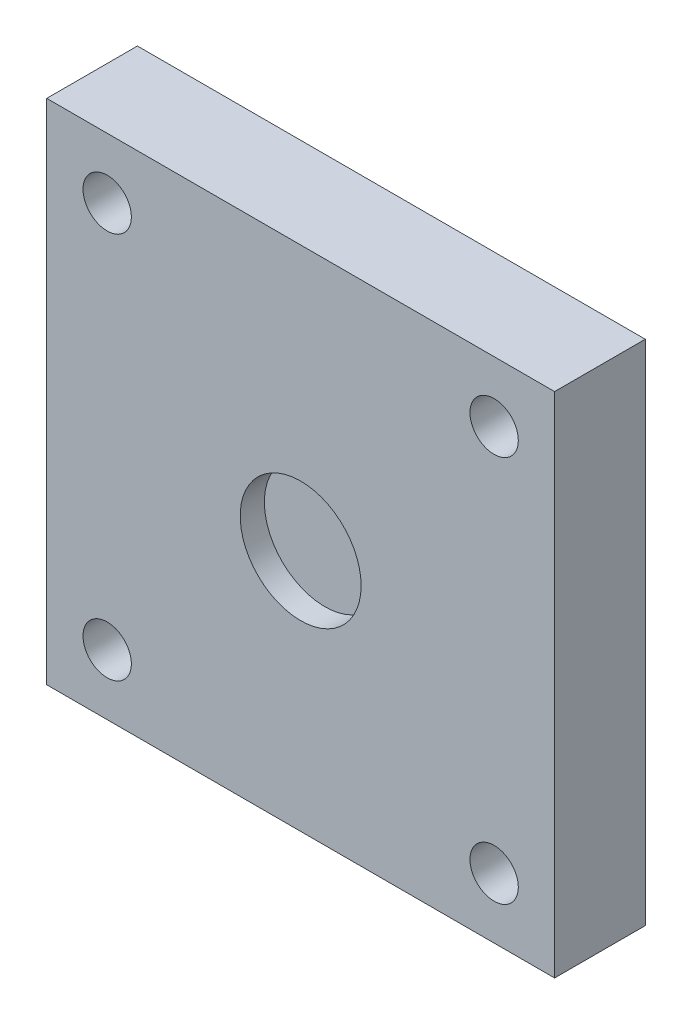
ISO-10303-21;
HEADER;
FILE_DESCRIPTION(('STEP AP214'),'2;1');
FILE_NAME('part.step','',(''),(''),'','','');
FILE_SCHEMA(('AUTOMOTIVE_DESIGN { 1 0 10303 214 1 1 1 1 }'));
ENDSEC;
DATA;
#1=APPLICATION_CONTEXT('core data for automotive mechanical design processes');
#2=APPLICATION_PROTOCOL_DEFINITION('international standard','automotive_design',2000,#1);
#3=PRODUCT_CONTEXT('',#1,'mechanical');
#4=PRODUCT('Part','Part','',(#3));
#5=PRODUCT_RELATED_PRODUCT_CATEGORY('part','',(#4));
#6=PRODUCT_DEFINITION_FORMATION('','',#4);
#7=PRODUCT_DEFINITION_CONTEXT('part definition',#1,'design');
#8=PRODUCT_DEFINITION('design','',#6,#7);
#9=PRODUCT_DEFINITION_SHAPE('','',#8);
#10=(LENGTH_UNIT() NAMED_UNIT(*) SI_UNIT(.MILLI.,.METRE.));
#11=(NAMED_UNIT(*) PLANE_ANGLE_UNIT() SI_UNIT($,.RADIAN.));
#12=(NAMED_UNIT(*) SI_UNIT($,.STERADIAN.) SOLID_ANGLE_UNIT());
#13=UNCERTAINTY_MEASURE_WITH_UNIT(LENGTH_MEASURE(1.E-05),#10,'distance_accuracy_value','');
#14=(GEOMETRIC_REPRESENTATION_CONTEXT(3) GLOBAL_UNCERTAINTY_ASSIGNED_CONTEXT((#13)) GLOBAL_UNIT_ASSIGNED_CONTEXT((#10,
#11,#12)) REPRESENTATION_CONTEXT('',''));
#15=CARTESIAN_POINT('',(0.,0.,0.));
#16=DIRECTION('',(0.,0.,1.));
#17=DIRECTION('',(1.,0.,0.));
#18=AXIS2_PLACEMENT_3D('',#15,#16,#17);
#19=CARTESIAN_POINT('',(0.,0.,0.));
#20=DIRECTION('',(0.,0.,-1.));
#21=DIRECTION('',(-1.,0.,0.));
#22=AXIS2_PLACEMENT_3D('',#19,#20,#21);
#23=PLANE('',#22);
#24=CARTESIAN_POINT('',(1.05217694,-3.5,0.));
#25=DIRECTION('',(0.,0.,1.));
#26=DIRECTION('',(1.,0.,0.));
#27=AXIS2_PLACEMENT_3D('',#24,#25,#26);
#28=CIRCLE('',#27,2.);
#29=CARTESIAN_POINT('',(3.05217694,-3.5,0.));
#30=VERTEX_POINT('',#29);
#31=EDGE_CURVE('E235',#30,#30,#28,.T.);
#32=ORIENTED_EDGE('',*,*,#31,.T.);
#33=EDGE_LOOP('',(#32));
#34=FACE_BOUND('',#33,.T.);
#35=CARTESIAN_POINT('',(33.05217694,28.5,0.));
#36=DIRECTION('',(0.,0.,1.));
#37=DIRECTION('',(1.,0.,0.));
#38=AXIS2_PLACEMENT_3D('',#35,#36,#37);
#39=CIRCLE('',#38,2.);
#40=CARTESIAN_POINT('',(35.05217694,28.5,0.));
#41=VERTEX_POINT('',#40);
#42=EDGE_CURVE('E241',#41,#41,#39,.T.);
#43=ORIENTED_EDGE('',*,*,#42,.T.);
#44=EDGE_LOOP('',(#43));
#45=FACE_BOUND('',#44,.T.);
#46=DIRECTION('',(1.,0.,0.));
#47=VECTOR('',#46,1.);
#48=CARTESIAN_POINT('',(-3.94782306,-8.5,0.));
#49=LINE('',#48,#47);
#50=CARTESIAN_POINT('',(-3.94782306,-8.5,0.));
#51=VERTEX_POINT('',#50);
#52=CARTESIAN_POINT('',(38.05217694,-8.5,0.));
#53=VERTEX_POINT('',#52);
#54=EDGE_CURVE('E209',#51,#53,#49,.T.);
#55=ORIENTED_EDGE('',*,*,#54,.F.);
#56=DIRECTION('',(0.,-1.,0.));
#57=VECTOR('',#56,1.);
#58=CARTESIAN_POINT('',(-3.94782306,33.5,0.));
#59=LINE('',#58,#57);
#60=CARTESIAN_POINT('',(-3.94782306,33.5,0.));
#61=VERTEX_POINT('',#60);
#62=EDGE_CURVE('E183',#61,#51,#59,.T.);
#63=ORIENTED_EDGE('',*,*,#62,.F.);
#64=DIRECTION('',(1.,0.,0.));
#65=VECTOR('',#64,1.);
#66=CARTESIAN_POINT('',(-3.94782306,33.5,0.));
#67=LINE('',#66,#65);
#68=CARTESIAN_POINT('',(38.05217694,33.5,0.));
#69=VERTEX_POINT('',#68);
#70=EDGE_CURVE('E247',#61,#69,#67,.T.);
#71=ORIENTED_EDGE('',*,*,#70,.T.);
#72=DIRECTION('',(0.,-1.,0.));
#73=VECTOR('',#72,1.);
#74=CARTESIAN_POINT('',(38.05217694,33.5,0.));
#75=LINE('',#74,#73);
#76=EDGE_CURVE('E245',#69,#53,#75,.T.);
#77=ORIENTED_EDGE('',*,*,#76,.T.);
#78=EDGE_LOOP('',(#55,#63,#71,#77));
#79=FACE_BOUND('',#78,.T.);
#80=CARTESIAN_POINT('',(1.05217694,28.5,0.));
#81=DIRECTION('',(0.,0.,1.));
#82=DIRECTION('',(1.,0.,0.));
#83=AXIS2_PLACEMENT_3D('',#80,#81,#82);
#84=CIRCLE('',#83,2.00000000000001);
#85=CARTESIAN_POINT('',(3.05217694000001,28.5,0.));
#86=VERTEX_POINT('',#85);
#87=EDGE_CURVE('E238',#86,#86,#84,.T.);
#88=ORIENTED_EDGE('',*,*,#87,.T.);
#89=EDGE_LOOP('',(#88));
#90=FACE_BOUND('',#89,.T.);
#91=CARTESIAN_POINT('',(33.05217694,-3.5,0.));
#92=DIRECTION('',(0.,0.,1.));
#93=DIRECTION('',(1.,0.,0.));
#94=AXIS2_PLACEMENT_3D('',#91,#92,#93);
#95=CIRCLE('',#94,2.);
#96=CARTESIAN_POINT('',(35.05217694,-3.5,0.));
#97=VERTEX_POINT('',#96);
#98=EDGE_CURVE('E232',#97,#97,#95,.T.);
#99=ORIENTED_EDGE('',*,*,#98,.T.);
#100=EDGE_LOOP('',(#99));
#101=FACE_BOUND('',#100,.T.);
#102=ADVANCED_FACE('F168',(#34,#45,#79,#90,#101),#23,.T.);
#103=CARTESIAN_POINT('',(-3.94782306,-8.5,5.5));
#104=DIRECTION('',(0.,1.,0.));
#105=DIRECTION('',(0.,0.,1.));
#106=AXIS2_PLACEMENT_3D('',#103,#104,#105);
#107=PLANE('',#106);
#108=ORIENTED_EDGE('',*,*,#54,.T.);
#109=DIRECTION('',(0.,0.,-1.));
#110=VECTOR('',#109,1.);
#111=CARTESIAN_POINT('',(38.05217694,-8.5,5.5));
#112=LINE('',#111,#110);
#113=CARTESIAN_POINT('',(38.05217694,-8.5,7.5));
#114=VERTEX_POINT('',#113);
#115=EDGE_CURVE('E12',#114,#53,#112,.T.);
#116=ORIENTED_EDGE('',*,*,#115,.F.);
#117=DIRECTION('',(1.,0.,0.));
#118=VECTOR('',#117,1.);
#119=CARTESIAN_POINT('',(-3.94782306,-8.5,7.5));
#120=LINE('',#119,#118);
#121=CARTESIAN_POINT('',(-3.94782306,-8.5,7.5));
#122=VERTEX_POINT('',#121);
#123=EDGE_CURVE('E207',#122,#114,#120,.T.);
#124=ORIENTED_EDGE('',*,*,#123,.F.);
#125=DIRECTION('',(0.,0.,-1.));
#126=VECTOR('',#125,1.);
#127=CARTESIAN_POINT('',(-3.94782306,-8.5,5.5));
#128=LINE('',#127,#126);
#129=EDGE_CURVE('E251',#122,#51,#128,.T.);
#130=ORIENTED_EDGE('',*,*,#129,.T.);
#131=EDGE_LOOP('',(#108,#116,#124,#130));
#132=FACE_BOUND('',#131,.T.);
#133=ADVANCED_FACE('F170',(#132),#107,.F.);
#134=CARTESIAN_POINT('',(38.05217694,33.5,5.5));
#135=DIRECTION('',(1.,0.,0.));
#136=DIRECTION('',(0.,1.,0.));
#137=AXIS2_PLACEMENT_3D('',#134,#135,#136);
#138=PLANE('',#137);
#139=ORIENTED_EDGE('',*,*,#76,.F.);
#140=DIRECTION('',(0.,0.,-1.));
#141=VECTOR('',#140,1.);
#142=CARTESIAN_POINT('',(38.05217694,33.5,5.5));
#143=LINE('',#142,#141);
#144=CARTESIAN_POINT('',(38.05217694,33.5,7.5));
#145=VERTEX_POINT('',#144);
#146=EDGE_CURVE('E176',#145,#69,#143,.T.);
#147=ORIENTED_EDGE('',*,*,#146,.F.);
#148=DIRECTION('',(0.,-1.,0.));
#149=VECTOR('',#148,1.);
#150=CARTESIAN_POINT('',(38.05217694,33.5,7.5));
#151=LINE('',#150,#149);
#152=EDGE_CURVE('E220',#145,#114,#151,.T.);
#153=ORIENTED_EDGE('',*,*,#152,.T.);
#154=ORIENTED_EDGE('',*,*,#115,.T.);
#155=EDGE_LOOP('',(#139,#147,#153,#154));
#156=FACE_BOUND('',#155,.T.);
#157=ADVANCED_FACE('F225',(#156),#138,.T.);
#158=CARTESIAN_POINT('',(-3.94782306,33.5,5.5));
#159=DIRECTION('',(0.,1.,0.));
#160=DIRECTION('',(0.,0.,1.));
#161=AXIS2_PLACEMENT_3D('',#158,#159,#160);
#162=PLANE('',#161);
#163=ORIENTED_EDGE('',*,*,#70,.F.);
#164=DIRECTION('',(0.,0.,-1.));
#165=VECTOR('',#164,1.);
#166=CARTESIAN_POINT('',(-3.94782306,33.5,5.5));
#167=LINE('',#166,#165);
#168=CARTESIAN_POINT('',(-3.94782306,33.5,7.5));
#169=VERTEX_POINT('',#168);
#170=EDGE_CURVE('E188',#169,#61,#167,.T.);
#171=ORIENTED_EDGE('',*,*,#170,.F.);
#172=DIRECTION('',(1.,0.,0.));
#173=VECTOR('',#172,1.);
#174=CARTESIAN_POINT('',(-3.94782306,33.5,7.5));
#175=LINE('',#174,#173);
#176=EDGE_CURVE('E226',#169,#145,#175,.T.);
#177=ORIENTED_EDGE('',*,*,#176,.T.);
#178=ORIENTED_EDGE('',*,*,#146,.T.);
#179=EDGE_LOOP('',(#163,#171,#177,#178));
#180=FACE_BOUND('',#179,.T.);
#181=ADVANCED_FACE('F255',(#180),#162,.T.);
#182=CARTESIAN_POINT('',(-3.94782306,33.5,5.5));
#183=DIRECTION('',(1.,0.,0.));
#184=DIRECTION('',(0.,0.,-1.));
#185=AXIS2_PLACEMENT_3D('',#182,#183,#184);
#186=PLANE('',#185);
#187=ORIENTED_EDGE('',*,*,#62,.T.);
#188=ORIENTED_EDGE('',*,*,#129,.F.);
#189=DIRECTION('',(0.,-1.,0.));
#190=VECTOR('',#189,1.);
#191=CARTESIAN_POINT('',(-3.94782306,33.5,7.5));
#192=LINE('',#191,#190);
#193=EDGE_CURVE('E222',#169,#122,#192,.T.);
#194=ORIENTED_EDGE('',*,*,#193,.F.);
#195=ORIENTED_EDGE('',*,*,#170,.T.);
#196=EDGE_LOOP('',(#187,#188,#194,#195));
#197=FACE_BOUND('',#196,.T.);
#198=ADVANCED_FACE('F302',(#197),#186,.F.);
#199=CARTESIAN_POINT('',(33.05217694,28.5,5.5));
#200=DIRECTION('',(0.,0.,-1.));
#201=DIRECTION('',(-1.,0.,0.));
#202=AXIS2_PLACEMENT_3D('',#199,#200,#201);
#203=CYLINDRICAL_SURFACE('',#202,2.);
#204=ORIENTED_EDGE('',*,*,#42,.F.);
#205=EDGE_LOOP('',(#204));
#206=FACE_BOUND('',#205,.T.);
#207=CARTESIAN_POINT('',(33.05217694,28.5,7.5));
#208=DIRECTION('',(0.,0.,1.));
#209=DIRECTION('',(1.,0.,0.));
#210=AXIS2_PLACEMENT_3D('',#207,#208,#209);
#211=CIRCLE('',#210,2.);
#212=CARTESIAN_POINT('',(35.05217694,28.5,7.5));
#213=VERTEX_POINT('',#212);
#214=EDGE_CURVE('E274',#213,#213,#211,.F.);
#215=ORIENTED_EDGE('',*,*,#214,.F.);
#216=EDGE_LOOP('',(#215));
#217=FACE_BOUND('',#216,.T.);
#218=ADVANCED_FACE('F293',(#206,#217),#203,.F.);
#219=CARTESIAN_POINT('',(1.05217694,28.5,5.5));
#220=DIRECTION('',(0.,0.,-1.));
#221=DIRECTION('',(-1.,0.,0.));
#222=AXIS2_PLACEMENT_3D('',#219,#220,#221);
#223=CYLINDRICAL_SURFACE('',#222,2.00000000000001);
#224=ORIENTED_EDGE('',*,*,#87,.F.);
#225=EDGE_LOOP('',(#224));
#226=FACE_BOUND('',#225,.T.);
#227=CARTESIAN_POINT('',(1.05217694,28.5,7.5));
#228=DIRECTION('',(0.,0.,1.));
#229=DIRECTION('',(1.,0.,0.));
#230=AXIS2_PLACEMENT_3D('',#227,#228,#229);
#231=CIRCLE('',#230,2.00000000000001);
#232=CARTESIAN_POINT('',(3.05217694000001,28.5,7.5));
#233=VERTEX_POINT('',#232);
#234=EDGE_CURVE('E223',#233,#233,#231,.F.);
#235=ORIENTED_EDGE('',*,*,#234,.F.);
#236=EDGE_LOOP('',(#235));
#237=FACE_BOUND('',#236,.T.);
#238=ADVANCED_FACE('F291',(#226,#237),#223,.F.);
#239=CARTESIAN_POINT('',(1.05217694,-3.5,5.5));
#240=DIRECTION('',(0.,0.,-1.));
#241=DIRECTION('',(-1.,0.,0.));
#242=AXIS2_PLACEMENT_3D('',#239,#240,#241);
#243=CYLINDRICAL_SURFACE('',#242,2.);
#244=ORIENTED_EDGE('',*,*,#31,.F.);
#245=EDGE_LOOP('',(#244));
#246=FACE_BOUND('',#245,.T.);
#247=CARTESIAN_POINT('',(1.05217694,-3.5,7.5));
#248=DIRECTION('',(0.,0.,1.));
#249=DIRECTION('',(1.,0.,0.));
#250=AXIS2_PLACEMENT_3D('',#247,#248,#249);
#251=CIRCLE('',#250,2.);
#252=CARTESIAN_POINT('',(3.05217694,-3.5,7.5));
#253=VERTEX_POINT('',#252);
#254=EDGE_CURVE('E275',#253,#253,#251,.F.);
#255=ORIENTED_EDGE('',*,*,#254,.F.);
#256=EDGE_LOOP('',(#255));
#257=FACE_BOUND('',#256,.T.);
#258=ADVANCED_FACE('F268',(#246,#257),#243,.F.);
#259=CARTESIAN_POINT('',(33.05217694,-3.5,5.5));
#260=DIRECTION('',(0.,0.,-1.));
#261=DIRECTION('',(-1.,0.,0.));
#262=AXIS2_PLACEMENT_3D('',#259,#260,#261);
#263=CYLINDRICAL_SURFACE('',#262,2.);
#264=ORIENTED_EDGE('',*,*,#98,.F.);
#265=EDGE_LOOP('',(#264));
#266=FACE_BOUND('',#265,.T.);
#267=CARTESIAN_POINT('',(33.05217694,-3.5,7.5));
#268=DIRECTION('',(0.,0.,1.));
#269=DIRECTION('',(1.,0.,0.));
#270=AXIS2_PLACEMENT_3D('',#267,#268,#269);
#271=CIRCLE('',#270,2.);
#272=CARTESIAN_POINT('',(35.05217694,-3.5,7.5));
#273=VERTEX_POINT('',#272);
#274=EDGE_CURVE('E272',#273,#273,#271,.F.);
#275=ORIENTED_EDGE('',*,*,#274,.F.);
#276=EDGE_LOOP('',(#275));
#277=FACE_BOUND('',#276,.T.);
#278=ADVANCED_FACE('F265',(#266,#277),#263,.F.);
#279=CARTESIAN_POINT('',(0.,0.,7.5));
#280=DIRECTION('',(0.,0.,-1.));
#281=DIRECTION('',(-1.,0.,0.));
#282=AXIS2_PLACEMENT_3D('',#279,#280,#281);
#283=PLANE('',#282);
#284=ORIENTED_EDGE('',*,*,#254,.T.);
#285=EDGE_LOOP('',(#284));
#286=FACE_BOUND('',#285,.T.);
#287=ORIENTED_EDGE('',*,*,#274,.T.);
#288=EDGE_LOOP('',(#287));
#289=FACE_BOUND('',#288,.T.);
#290=ORIENTED_EDGE('',*,*,#214,.T.);
#291=EDGE_LOOP('',(#290));
#292=FACE_BOUND('',#291,.T.);
#293=ORIENTED_EDGE('',*,*,#234,.T.);
#294=EDGE_LOOP('',(#293));
#295=FACE_BOUND('',#294,.T.);
#296=ORIENTED_EDGE('',*,*,#123,.T.);
#297=ORIENTED_EDGE('',*,*,#152,.F.);
#298=ORIENTED_EDGE('',*,*,#176,.F.);
#299=ORIENTED_EDGE('',*,*,#193,.T.);
#300=EDGE_LOOP('',(#296,#297,#298,#299));
#301=FACE_BOUND('',#300,.T.);
#302=CARTESIAN_POINT('',(17.05217694,11.5921362710779,7.5));
#303=DIRECTION('',(0.,0.,1.));
#304=DIRECTION('',(1.,0.,0.));
#305=AXIS2_PLACEMENT_3D('',#302,#303,#304);
#306=CIRCLE('',#305,5.);
#307=CARTESIAN_POINT('',(22.05217694,11.5921362710779,7.5));
#308=VERTEX_POINT('',#307);
#309=EDGE_CURVE('E283',#308,#308,#306,.T.);
#310=ORIENTED_EDGE('',*,*,#309,.F.);
#311=EDGE_LOOP('',(#310));
#312=FACE_BOUND('',#311,.T.);
#313=ADVANCED_FACE('F217',(#286,#289,#292,#295,#301,#312),#283,.F.);
#314=CARTESIAN_POINT('',(17.05217694,11.5921362710779,7.5));
#315=DIRECTION('',(0.,0.,-1.));
#316=DIRECTION('',(-1.,0.,0.));
#317=AXIS2_PLACEMENT_3D('',#314,#315,#316);
#318=CYLINDRICAL_SURFACE('',#317,5.);
#319=ORIENTED_EDGE('',*,*,#309,.T.);
#320=EDGE_LOOP('',(#319));
#321=FACE_BOUND('',#320,.T.);
#322=CARTESIAN_POINT('',(17.05217694,11.5921362710779,5.5));
#323=DIRECTION('',(0.,0.,1.));
#324=DIRECTION('',(1.,0.,0.));
#325=AXIS2_PLACEMENT_3D('',#322,#323,#324);
#326=CIRCLE('',#325,5.);
#327=CARTESIAN_POINT('',(22.05217694,11.5921362710779,5.5));
#328=VERTEX_POINT('',#327);
#329=EDGE_CURVE('E278',#328,#328,#326,.T.);
#330=ORIENTED_EDGE('',*,*,#329,.F.);
#331=EDGE_LOOP('',(#330));
#332=FACE_BOUND('',#331,.T.);
#333=ADVANCED_FACE('F308',(#321,#332),#318,.F.);
#334=CARTESIAN_POINT('',(0.,0.,5.5));
#335=DIRECTION('',(0.,0.,-1.));
#336=DIRECTION('',(-1.,0.,0.));
#337=AXIS2_PLACEMENT_3D('',#334,#335,#336);
#338=PLANE('',#337);
#339=ORIENTED_EDGE('',*,*,#329,.T.);
#340=EDGE_LOOP('',(#339));
#341=FACE_BOUND('',#340,.T.);
#342=ADVANCED_FACE('F306',(#341),#338,.F.);
#343=CLOSED_SHELL('',(#102,#133,#157,#181,#198,#218,#238,#258,#278,#313,#333,#342));
#344=MANIFOLD_SOLID_BREP('B2',#343);
#345=ADVANCED_BREP_SHAPE_REPRESENTATION('',(#18,#344),#14);
#346=SHAPE_DEFINITION_REPRESENTATION(#9,#345);
ENDSEC;
END-ISO-10303-21;
